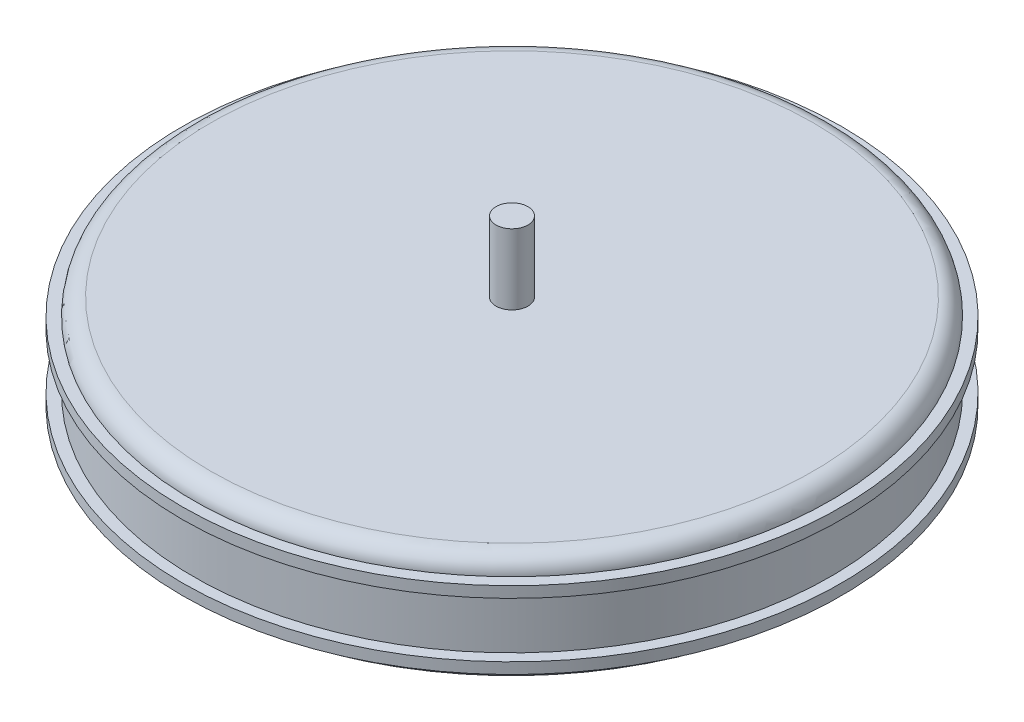
ISO-10303-21;
HEADER;
FILE_DESCRIPTION(('STEP AP214'),'2;1');
FILE_NAME('part.step','',(''),(''),'','','');
FILE_SCHEMA(('AUTOMOTIVE_DESIGN { 1 0 10303 214 1 1 1 1 }'));
ENDSEC;
DATA;
#1=APPLICATION_CONTEXT('core data for automotive mechanical design processes');
#2=APPLICATION_PROTOCOL_DEFINITION('international standard','automotive_design',2000,#1);
#3=PRODUCT_CONTEXT('',#1,'mechanical');
#4=PRODUCT('Part','Part','',(#3));
#5=PRODUCT_RELATED_PRODUCT_CATEGORY('part','',(#4));
#6=PRODUCT_DEFINITION_FORMATION('','',#4);
#7=PRODUCT_DEFINITION_CONTEXT('part definition',#1,'design');
#8=PRODUCT_DEFINITION('design','',#6,#7);
#9=PRODUCT_DEFINITION_SHAPE('','',#8);
#10=(LENGTH_UNIT() NAMED_UNIT(*) SI_UNIT(.MILLI.,.METRE.));
#11=(NAMED_UNIT(*) PLANE_ANGLE_UNIT() SI_UNIT($,.RADIAN.));
#12=(NAMED_UNIT(*) SI_UNIT($,.STERADIAN.) SOLID_ANGLE_UNIT());
#13=UNCERTAINTY_MEASURE_WITH_UNIT(LENGTH_MEASURE(1.E-05),#10,'distance_accuracy_value','');
#14=(GEOMETRIC_REPRESENTATION_CONTEXT(3) GLOBAL_UNCERTAINTY_ASSIGNED_CONTEXT((#13)) GLOBAL_UNIT_ASSIGNED_CONTEXT((#10,
#11,#12)) REPRESENTATION_CONTEXT('',''));
#15=CARTESIAN_POINT('',(0.,0.,0.));
#16=DIRECTION('',(0.,0.,1.));
#17=DIRECTION('',(1.,0.,0.));
#18=AXIS2_PLACEMENT_3D('',#15,#16,#17);
#19=CARTESIAN_POINT('',(0.,44.75,7.25000000000001));
#20=DIRECTION('',(0.,-1.,0.));
#21=DIRECTION('',(0.,0.,-1.));
#22=AXIS2_PLACEMENT_3D('',#19,#20,#21);
#23=PLANE('',#22);
#24=CARTESIAN_POINT('',(0.,44.75,0.));
#25=DIRECTION('',(0.,-1.,0.));
#26=DIRECTION('',(0.,0.,-1.));
#27=AXIS2_PLACEMENT_3D('',#24,#25,#26);
#28=CIRCLE('',#27,7.25000000000002);
#29=CARTESIAN_POINT('',(0.,44.75,-7.25000000000003));
#30=VERTEX_POINT('',#29);
#31=EDGE_CURVE('E81',#30,#30,#28,.T.);
#32=ORIENTED_EDGE('',*,*,#31,.F.);
#33=EDGE_LOOP('',(#32));
#34=FACE_BOUND('',#33,.T.);
#35=ADVANCED_FACE('F35',(#34),#23,.F.);
#36=CARTESIAN_POINT('',(0.,-69.75,7.25000000000001));
#37=DIRECTION('',(0.,1.,0.));
#38=DIRECTION('',(0.,0.,1.));
#39=AXIS2_PLACEMENT_3D('',#36,#37,#38);
#40=PLANE('',#39);
#41=CARTESIAN_POINT('',(0.,-69.75,0.));
#42=DIRECTION('',(0.,-1.,0.));
#43=DIRECTION('',(0.,0.,-1.));
#44=AXIS2_PLACEMENT_3D('',#41,#42,#43);
#45=CIRCLE('',#44,7.25000000000002);
#46=CARTESIAN_POINT('',(0.,-69.75,-7.25000000000003));
#47=VERTEX_POINT('',#46);
#48=EDGE_CURVE('E10',#47,#47,#45,.T.);
#49=ORIENTED_EDGE('',*,*,#48,.T.);
#50=EDGE_LOOP('',(#49));
#51=FACE_BOUND('',#50,.T.);
#52=ADVANCED_FACE('F88',(#51),#40,.F.);
#53=CARTESIAN_POINT('',(0.,-69.75,0.));
#54=DIRECTION('',(0.,-1.,0.));
#55=DIRECTION('',(0.,0.,-1.));
#56=AXIS2_PLACEMENT_3D('',#53,#54,#55);
#57=CYLINDRICAL_SURFACE('',#56,7.25000000000002);
#58=ORIENTED_EDGE('',*,*,#48,.F.);
#59=EDGE_LOOP('',(#58));
#60=FACE_BOUND('',#59,.T.);
#61=CARTESIAN_POINT('',(0.,-37.75,0.));
#62=DIRECTION('',(0.,-1.,0.));
#63=DIRECTION('',(0.,0.,-1.));
#64=AXIS2_PLACEMENT_3D('',#61,#62,#63);
#65=CIRCLE('',#64,7.25000000000002);
#66=CARTESIAN_POINT('',(0.,-37.75,-7.25000000000003));
#67=VERTEX_POINT('',#66);
#68=EDGE_CURVE('E41',#67,#67,#65,.T.);
#69=ORIENTED_EDGE('',*,*,#68,.T.);
#70=EDGE_LOOP('',(#69));
#71=FACE_BOUND('',#70,.T.);
#72=ADVANCED_FACE('F92',(#60,#71),#57,.T.);
#73=CARTESIAN_POINT('',(0.,-37.75,7.25000000000001));
#74=DIRECTION('',(0.,1.,0.));
#75=DIRECTION('',(0.,0.,1.));
#76=AXIS2_PLACEMENT_3D('',#73,#74,#75);
#77=PLANE('',#76);
#78=ORIENTED_EDGE('',*,*,#68,.F.);
#79=EDGE_LOOP('',(#78));
#80=FACE_BOUND('',#79,.T.);
#81=CARTESIAN_POINT('',(0.,-37.75,0.));
#82=DIRECTION('',(0.,-1.,0.));
#83=DIRECTION('',(0.,0.,-1.));
#84=AXIS2_PLACEMENT_3D('',#81,#82,#83);
#85=CIRCLE('',#84,137.25);
#86=CARTESIAN_POINT('',(0.,-37.75,-137.25));
#87=VERTEX_POINT('',#86);
#88=EDGE_CURVE('E45',#87,#87,#85,.T.);
#89=ORIENTED_EDGE('',*,*,#88,.T.);
#90=EDGE_LOOP('',(#89));
#91=FACE_BOUND('',#90,.T.);
#92=ADVANCED_FACE('F96',(#80,#91),#77,.F.);
#93=CARTESIAN_POINT('',(0.,-30.,0.));
#94=DIRECTION('',(0.,-1.,0.));
#95=DIRECTION('',(0.,0.,-1.));
#96=AXIS2_PLACEMENT_3D('',#93,#94,#95);
#97=TOROIDAL_SURFACE('',#96,137.25,7.74999999999998);
#98=ORIENTED_EDGE('',*,*,#88,.F.);
#99=EDGE_LOOP('',(#98));
#100=FACE_BOUND('',#99,.T.);
#101=CARTESIAN_POINT('',(0.,-30.,0.));
#102=DIRECTION('',(0.,-1.,0.));
#103=DIRECTION('',(0.,0.,-1.));
#104=AXIS2_PLACEMENT_3D('',#101,#102,#103);
#105=CIRCLE('',#104,145.);
#106=CARTESIAN_POINT('',(0.,-30.,-145.));
#107=VERTEX_POINT('',#106);
#108=EDGE_CURVE('E49',#107,#107,#105,.T.);
#109=ORIENTED_EDGE('',*,*,#108,.T.);
#110=EDGE_LOOP('',(#109));
#111=FACE_BOUND('',#110,.T.);
#112=ADVANCED_FACE('F102',(#100,#111),#97,.T.);
#113=CARTESIAN_POINT('',(0.,-30.,145.));
#114=DIRECTION('',(0.,1.,0.));
#115=DIRECTION('',(0.,0.,1.));
#116=AXIS2_PLACEMENT_3D('',#113,#114,#115);
#117=PLANE('',#116);
#118=ORIENTED_EDGE('',*,*,#108,.F.);
#119=EDGE_LOOP('',(#118));
#120=FACE_BOUND('',#119,.T.);
#121=CARTESIAN_POINT('',(0.,-30.,0.));
#122=DIRECTION('',(0.,-1.,0.));
#123=DIRECTION('',(0.,0.,-1.));
#124=AXIS2_PLACEMENT_3D('',#121,#122,#123);
#125=CIRCLE('',#124,150.);
#126=CARTESIAN_POINT('',(0.,-30.,-150.));
#127=VERTEX_POINT('',#126);
#128=EDGE_CURVE('E54',#127,#127,#125,.T.);
#129=ORIENTED_EDGE('',*,*,#128,.T.);
#130=EDGE_LOOP('',(#129));
#131=FACE_BOUND('',#130,.T.);
#132=ADVANCED_FACE('F106',(#120,#131),#117,.F.);
#133=CARTESIAN_POINT('',(0.,-69.75,0.));
#134=DIRECTION('',(0.,-1.,0.));
#135=DIRECTION('',(0.,0.,-1.));
#136=AXIS2_PLACEMENT_3D('',#133,#134,#135);
#137=CYLINDRICAL_SURFACE('',#136,150.);
#138=ORIENTED_EDGE('',*,*,#128,.F.);
#139=EDGE_LOOP('',(#138));
#140=FACE_BOUND('',#139,.T.);
#141=CARTESIAN_POINT('',(0.,-25.,0.));
#142=DIRECTION('',(0.,-1.,0.));
#143=DIRECTION('',(0.,0.,-1.));
#144=AXIS2_PLACEMENT_3D('',#141,#142,#143);
#145=CIRCLE('',#144,150.);
#146=CARTESIAN_POINT('',(0.,-25.,-150.));
#147=VERTEX_POINT('',#146);
#148=EDGE_CURVE('E57',#147,#147,#145,.T.);
#149=ORIENTED_EDGE('',*,*,#148,.T.);
#150=EDGE_LOOP('',(#149));
#151=FACE_BOUND('',#150,.T.);
#152=ADVANCED_FACE('F110',(#140,#151),#137,.T.);
#153=CARTESIAN_POINT('',(0.,-25.,150.));
#154=DIRECTION('',(0.,-1.,0.));
#155=DIRECTION('',(0.,0.,-1.));
#156=AXIS2_PLACEMENT_3D('',#153,#154,#155);
#157=PLANE('',#156);
#158=ORIENTED_EDGE('',*,*,#148,.F.);
#159=EDGE_LOOP('',(#158));
#160=FACE_BOUND('',#159,.T.);
#161=CARTESIAN_POINT('',(0.,-25.,0.));
#162=DIRECTION('',(0.,-1.,0.));
#163=DIRECTION('',(0.,0.,-1.));
#164=AXIS2_PLACEMENT_3D('',#161,#162,#163);
#165=CIRCLE('',#164,145.);
#166=CARTESIAN_POINT('',(0.,-25.,-145.));
#167=VERTEX_POINT('',#166);
#168=EDGE_CURVE('E60',#167,#167,#165,.T.);
#169=ORIENTED_EDGE('',*,*,#168,.T.);
#170=EDGE_LOOP('',(#169));
#171=FACE_BOUND('',#170,.T.);
#172=ADVANCED_FACE('F114',(#160,#171),#157,.F.);
#173=CARTESIAN_POINT('',(0.,-69.75,0.));
#174=DIRECTION('',(0.,-1.,0.));
#175=DIRECTION('',(0.,0.,-1.));
#176=AXIS2_PLACEMENT_3D('',#173,#174,#175);
#177=CYLINDRICAL_SURFACE('',#176,145.);
#178=ORIENTED_EDGE('',*,*,#168,.F.);
#179=EDGE_LOOP('',(#178));
#180=FACE_BOUND('',#179,.T.);
#181=CARTESIAN_POINT('',(0.,0.,0.));
#182=DIRECTION('',(0.,-1.,0.));
#183=DIRECTION('',(0.,0.,-1.));
#184=AXIS2_PLACEMENT_3D('',#181,#182,#183);
#185=CIRCLE('',#184,145.);
#186=CARTESIAN_POINT('',(0.,0.,-145.));
#187=VERTEX_POINT('',#186);
#188=EDGE_CURVE('E63',#187,#187,#185,.T.);
#189=ORIENTED_EDGE('',*,*,#188,.T.);
#190=EDGE_LOOP('',(#189));
#191=FACE_BOUND('',#190,.T.);
#192=ADVANCED_FACE('F118',(#180,#191),#177,.T.);
#193=CARTESIAN_POINT('',(0.,0.,150.));
#194=DIRECTION('',(0.,1.,0.));
#195=DIRECTION('',(0.,0.,1.));
#196=AXIS2_PLACEMENT_3D('',#193,#194,#195);
#197=PLANE('',#196);
#198=ORIENTED_EDGE('',*,*,#188,.F.);
#199=EDGE_LOOP('',(#198));
#200=FACE_BOUND('',#199,.T.);
#201=CARTESIAN_POINT('',(0.,0.,0.));
#202=DIRECTION('',(0.,-1.,0.));
#203=DIRECTION('',(0.,0.,-1.));
#204=AXIS2_PLACEMENT_3D('',#201,#202,#203);
#205=CIRCLE('',#204,150.);
#206=CARTESIAN_POINT('',(0.,0.,-150.));
#207=VERTEX_POINT('',#206);
#208=EDGE_CURVE('E66',#207,#207,#205,.T.);
#209=ORIENTED_EDGE('',*,*,#208,.T.);
#210=EDGE_LOOP('',(#209));
#211=FACE_BOUND('',#210,.T.);
#212=ADVANCED_FACE('F122',(#200,#211),#197,.F.);
#213=CARTESIAN_POINT('',(0.,-69.75,0.));
#214=DIRECTION('',(0.,-1.,0.));
#215=DIRECTION('',(0.,0.,-1.));
#216=AXIS2_PLACEMENT_3D('',#213,#214,#215);
#217=CYLINDRICAL_SURFACE('',#216,150.);
#218=ORIENTED_EDGE('',*,*,#208,.F.);
#219=EDGE_LOOP('',(#218));
#220=FACE_BOUND('',#219,.T.);
#221=CARTESIAN_POINT('',(0.,5.,0.));
#222=DIRECTION('',(0.,-1.,0.));
#223=DIRECTION('',(0.,0.,-1.));
#224=AXIS2_PLACEMENT_3D('',#221,#222,#223);
#225=CIRCLE('',#224,150.);
#226=CARTESIAN_POINT('',(0.,5.,-150.));
#227=VERTEX_POINT('',#226);
#228=EDGE_CURVE('E69',#227,#227,#225,.T.);
#229=ORIENTED_EDGE('',*,*,#228,.T.);
#230=EDGE_LOOP('',(#229));
#231=FACE_BOUND('',#230,.T.);
#232=ADVANCED_FACE('F126',(#220,#231),#217,.T.);
#233=CARTESIAN_POINT('',(0.,5.,145.));
#234=DIRECTION('',(0.,-1.,0.));
#235=DIRECTION('',(0.,0.,-1.));
#236=AXIS2_PLACEMENT_3D('',#233,#234,#235);
#237=PLANE('',#236);
#238=ORIENTED_EDGE('',*,*,#228,.F.);
#239=EDGE_LOOP('',(#238));
#240=FACE_BOUND('',#239,.T.);
#241=CARTESIAN_POINT('',(0.,5.,0.));
#242=DIRECTION('',(0.,-1.,0.));
#243=DIRECTION('',(0.,0.,-1.));
#244=AXIS2_PLACEMENT_3D('',#241,#242,#243);
#245=CIRCLE('',#244,145.);
#246=CARTESIAN_POINT('',(0.,5.,-145.));
#247=VERTEX_POINT('',#246);
#248=EDGE_CURVE('E72',#247,#247,#245,.T.);
#249=ORIENTED_EDGE('',*,*,#248,.T.);
#250=EDGE_LOOP('',(#249));
#251=FACE_BOUND('',#250,.T.);
#252=ADVANCED_FACE('F130',(#240,#251),#237,.F.);
#253=CARTESIAN_POINT('',(0.,5.,0.));
#254=DIRECTION('',(0.,-1.,0.));
#255=DIRECTION('',(0.,0.,-1.));
#256=AXIS2_PLACEMENT_3D('',#253,#254,#255);
#257=TOROIDAL_SURFACE('',#256,137.25,7.74999999999998);
#258=ORIENTED_EDGE('',*,*,#248,.F.);
#259=EDGE_LOOP('',(#258));
#260=FACE_BOUND('',#259,.T.);
#261=CARTESIAN_POINT('',(0.,12.75,0.));
#262=DIRECTION('',(0.,-1.,0.));
#263=DIRECTION('',(0.,0.,-1.));
#264=AXIS2_PLACEMENT_3D('',#261,#262,#263);
#265=CIRCLE('',#264,137.25);
#266=CARTESIAN_POINT('',(0.,12.75,-137.25));
#267=VERTEX_POINT('',#266);
#268=EDGE_CURVE('E75',#267,#267,#265,.T.);
#269=ORIENTED_EDGE('',*,*,#268,.T.);
#270=EDGE_LOOP('',(#269));
#271=FACE_BOUND('',#270,.T.);
#272=ADVANCED_FACE('F134',(#260,#271),#257,.T.);
#273=CARTESIAN_POINT('',(0.,12.75,7.25000000000001));
#274=DIRECTION('',(0.,-1.,0.));
#275=DIRECTION('',(0.,0.,-1.));
#276=AXIS2_PLACEMENT_3D('',#273,#274,#275);
#277=PLANE('',#276);
#278=ORIENTED_EDGE('',*,*,#268,.F.);
#279=EDGE_LOOP('',(#278));
#280=FACE_BOUND('',#279,.T.);
#281=CARTESIAN_POINT('',(0.,12.75,0.));
#282=DIRECTION('',(0.,-1.,0.));
#283=DIRECTION('',(0.,0.,-1.));
#284=AXIS2_PLACEMENT_3D('',#281,#282,#283);
#285=CIRCLE('',#284,7.25000000000002);
#286=CARTESIAN_POINT('',(0.,12.75,-7.25000000000003));
#287=VERTEX_POINT('',#286);
#288=EDGE_CURVE('E78',#287,#287,#285,.T.);
#289=ORIENTED_EDGE('',*,*,#288,.T.);
#290=EDGE_LOOP('',(#289));
#291=FACE_BOUND('',#290,.T.);
#292=ADVANCED_FACE('F138',(#280,#291),#277,.F.);
#293=CARTESIAN_POINT('',(0.,-69.75,0.));
#294=DIRECTION('',(0.,-1.,0.));
#295=DIRECTION('',(0.,0.,-1.));
#296=AXIS2_PLACEMENT_3D('',#293,#294,#295);
#297=CYLINDRICAL_SURFACE('',#296,7.25000000000002);
#298=ORIENTED_EDGE('',*,*,#288,.F.);
#299=EDGE_LOOP('',(#298));
#300=FACE_BOUND('',#299,.T.);
#301=ORIENTED_EDGE('',*,*,#31,.T.);
#302=EDGE_LOOP('',(#301));
#303=FACE_BOUND('',#302,.T.);
#304=ADVANCED_FACE('F85',(#300,#303),#297,.T.);
#305=CLOSED_SHELL('',(#35,#52,#72,#92,#112,#132,#152,#172,#192,#212,#232,#252,#272,#292,#304));
#306=MANIFOLD_SOLID_BREP('B2',#305);
#307=ADVANCED_BREP_SHAPE_REPRESENTATION('',(#18,#306),#14);
#308=SHAPE_DEFINITION_REPRESENTATION(#9,#307);
ENDSEC;
END-ISO-10303-21;
